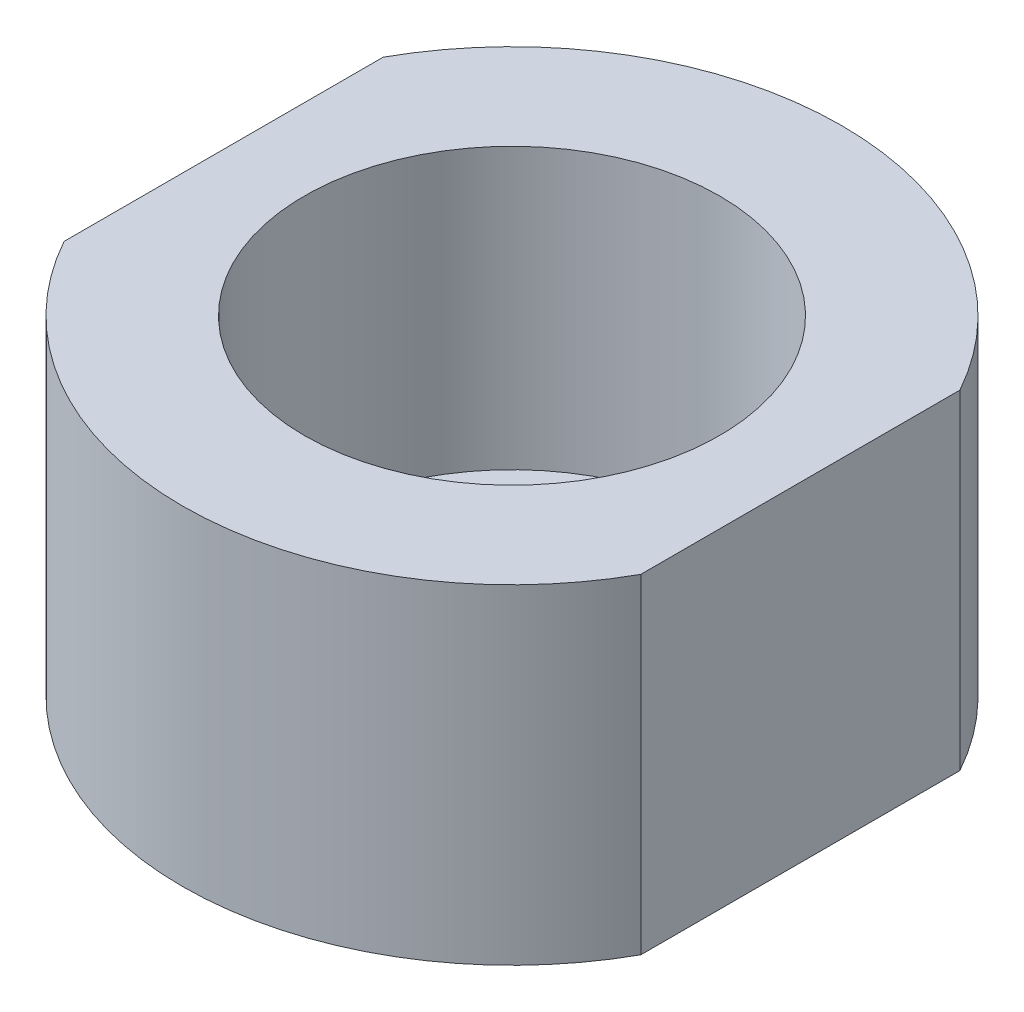
ISO-10303-21;
HEADER;
FILE_DESCRIPTION(('STEP AP214'),'2;1');
FILE_NAME('part.step','',(''),(''),'','','');
FILE_SCHEMA(('AUTOMOTIVE_DESIGN { 1 0 10303 214 1 1 1 1 }'));
ENDSEC;
DATA;
#1=APPLICATION_CONTEXT('core data for automotive mechanical design processes');
#2=APPLICATION_PROTOCOL_DEFINITION('international standard','automotive_design',2000,#1);
#3=PRODUCT_CONTEXT('',#1,'mechanical');
#4=PRODUCT('Part','Part','',(#3));
#5=PRODUCT_RELATED_PRODUCT_CATEGORY('part','',(#4));
#6=PRODUCT_DEFINITION_FORMATION('','',#4);
#7=PRODUCT_DEFINITION_CONTEXT('part definition',#1,'design');
#8=PRODUCT_DEFINITION('design','',#6,#7);
#9=PRODUCT_DEFINITION_SHAPE('','',#8);
#10=(LENGTH_UNIT() NAMED_UNIT(*) SI_UNIT(.MILLI.,.METRE.));
#11=(NAMED_UNIT(*) PLANE_ANGLE_UNIT() SI_UNIT($,.RADIAN.));
#12=(NAMED_UNIT(*) SI_UNIT($,.STERADIAN.) SOLID_ANGLE_UNIT());
#13=UNCERTAINTY_MEASURE_WITH_UNIT(LENGTH_MEASURE(1.E-05),#10,'distance_accuracy_value','');
#14=(GEOMETRIC_REPRESENTATION_CONTEXT(3) GLOBAL_UNCERTAINTY_ASSIGNED_CONTEXT((#13)) GLOBAL_UNIT_ASSIGNED_CONTEXT((#10,
#11,#12)) REPRESENTATION_CONTEXT('',''));
#15=CARTESIAN_POINT('',(0.,0.,0.));
#16=DIRECTION('',(0.,0.,1.));
#17=DIRECTION('',(1.,0.,0.));
#18=AXIS2_PLACEMENT_3D('',#15,#16,#17);
#19=CARTESIAN_POINT('',(0.,25.4,0.));
#20=DIRECTION('',(0.,-1.,0.));
#21=DIRECTION('',(0.,0.,-1.));
#22=AXIS2_PLACEMENT_3D('',#19,#20,#21);
#23=CYLINDRICAL_SURFACE('',#22,25.4);
#24=DIRECTION('',(0.,-1.,0.));
#25=VECTOR('',#24,1.);
#26=CARTESIAN_POINT('',(22.225,25.4,-12.2967221242086));
#27=LINE('',#26,#25);
#28=CARTESIAN_POINT('',(22.225,0.,-12.2967221242086));
#29=VERTEX_POINT('',#28);
#30=CARTESIAN_POINT('',(22.225,25.4,-12.2967221242086));
#31=VERTEX_POINT('',#30);
#32=EDGE_CURVE('E72',#29,#31,#27,.F.);
#33=ORIENTED_EDGE('',*,*,#32,.F.);
#34=CARTESIAN_POINT('',(0.,0.,0.));
#35=DIRECTION('',(0.,1.,0.));
#36=DIRECTION('',(0.,0.,1.));
#37=AXIS2_PLACEMENT_3D('',#34,#35,#36);
#38=CIRCLE('',#37,25.4);
#39=CARTESIAN_POINT('',(-22.225,0.,-12.2967221242086));
#40=VERTEX_POINT('',#39);
#41=EDGE_CURVE('E92',#29,#40,#38,.T.);
#42=ORIENTED_EDGE('',*,*,#41,.T.);
#43=DIRECTION('',(0.,-1.,0.));
#44=VECTOR('',#43,1.);
#45=CARTESIAN_POINT('',(-22.225,25.4,-12.2967221242086));
#46=LINE('',#45,#44);
#47=CARTESIAN_POINT('',(-22.225,25.4,-12.2967221242086));
#48=VERTEX_POINT('',#47);
#49=EDGE_CURVE('E127',#48,#40,#46,.T.);
#50=ORIENTED_EDGE('',*,*,#49,.F.);
#51=CARTESIAN_POINT('',(0.,25.4,0.));
#52=DIRECTION('',(0.,1.,0.));
#53=DIRECTION('',(0.,0.,1.));
#54=AXIS2_PLACEMENT_3D('',#51,#52,#53);
#55=CIRCLE('',#54,25.4);
#56=EDGE_CURVE('E13',#31,#48,#55,.T.);
#57=ORIENTED_EDGE('',*,*,#56,.F.);
#58=EDGE_LOOP('',(#33,#42,#50,#57));
#59=FACE_BOUND('',#58,.T.);
#60=ADVANCED_FACE('F47',(#59),#23,.T.);
#61=CARTESIAN_POINT('',(-22.225,0.,12.2967221242086));
#62=VERTEX_POINT('',#61);
#63=CARTESIAN_POINT('',(22.225,0.,12.2967221242085));
#64=VERTEX_POINT('',#63);
#65=EDGE_CURVE('E51',#62,#64,#38,.T.);
#66=ORIENTED_EDGE('',*,*,#65,.T.);
#67=DIRECTION('',(0.,-1.,0.));
#68=VECTOR('',#67,1.);
#69=CARTESIAN_POINT('',(22.225,25.4,12.2967221242086));
#70=LINE('',#69,#68);
#71=CARTESIAN_POINT('',(22.225,25.4,12.2967221242086));
#72=VERTEX_POINT('',#71);
#73=EDGE_CURVE('E93',#64,#72,#70,.F.);
#74=ORIENTED_EDGE('',*,*,#73,.T.);
#75=CARTESIAN_POINT('',(-22.225,25.4,12.2967221242086));
#76=VERTEX_POINT('',#75);
#77=EDGE_CURVE('E56',#76,#72,#55,.T.);
#78=ORIENTED_EDGE('',*,*,#77,.F.);
#79=DIRECTION('',(0.,-1.,0.));
#80=VECTOR('',#79,1.);
#81=CARTESIAN_POINT('',(-22.225,25.4,12.2967221242086));
#82=LINE('',#81,#80);
#83=EDGE_CURVE('E64',#76,#62,#82,.T.);
#84=ORIENTED_EDGE('',*,*,#83,.T.);
#85=EDGE_LOOP('',(#66,#74,#78,#84));
#86=FACE_BOUND('',#85,.T.);
#87=ADVANCED_FACE('F49',(#86),#23,.T.);
#88=CARTESIAN_POINT('',(0.,25.4,0.));
#89=DIRECTION('',(0.,1.,0.));
#90=DIRECTION('',(0.,0.,1.));
#91=AXIS2_PLACEMENT_3D('',#88,#89,#90);
#92=PLANE('',#91);
#93=CARTESIAN_POINT('',(0.,25.4,0.));
#94=DIRECTION('',(0.,1.,0.));
#95=DIRECTION('',(0.,0.,1.));
#96=AXIS2_PLACEMENT_3D('',#93,#94,#95);
#97=CIRCLE('',#96,16.);
#98=CARTESIAN_POINT('',(0.,25.4,16.));
#99=VERTEX_POINT('',#98);
#100=EDGE_CURVE('E114',#99,#99,#97,.T.);
#101=ORIENTED_EDGE('',*,*,#100,.F.);
#102=EDGE_LOOP('',(#101));
#103=FACE_BOUND('',#102,.T.);
#104=ORIENTED_EDGE('',*,*,#77,.T.);
#105=DIRECTION('',(0.,0.,-1.));
#106=VECTOR('',#105,1.);
#107=CARTESIAN_POINT('',(22.225,25.4,25.401));
#108=LINE('',#107,#106);
#109=EDGE_CURVE('E120',#72,#31,#108,.T.);
#110=ORIENTED_EDGE('',*,*,#109,.T.);
#111=ORIENTED_EDGE('',*,*,#56,.T.);
#112=DIRECTION('',(0.,0.,-1.));
#113=VECTOR('',#112,1.);
#114=CARTESIAN_POINT('',(-22.225,25.4,25.401));
#115=LINE('',#114,#113);
#116=EDGE_CURVE('E94',#76,#48,#115,.T.);
#117=ORIENTED_EDGE('',*,*,#116,.F.);
#118=EDGE_LOOP('',(#104,#110,#111,#117));
#119=FACE_BOUND('',#118,.T.);
#120=ADVANCED_FACE('F150',(#103,#119),#92,.T.);
#121=CARTESIAN_POINT('',(0.,0.,0.));
#122=DIRECTION('',(0.,1.,0.));
#123=DIRECTION('',(0.,0.,1.));
#124=AXIS2_PLACEMENT_3D('',#121,#122,#123);
#125=PLANE('',#124);
#126=CARTESIAN_POINT('',(0.,0.,-8.89));
#127=DIRECTION('',(0.,1.,0.));
#128=DIRECTION('',(0.,0.,1.));
#129=AXIS2_PLACEMENT_3D('',#126,#127,#128);
#130=CIRCLE('',#129,1.);
#131=CARTESIAN_POINT('',(0.,0.,-7.89));
#132=VERTEX_POINT('',#131);
#133=EDGE_CURVE('E129',#132,#132,#130,.F.);
#134=ORIENTED_EDGE('',*,*,#133,.F.);
#135=EDGE_LOOP('',(#134));
#136=FACE_BOUND('',#135,.T.);
#137=CARTESIAN_POINT('',(7.6989658396442,0.,4.44499999999969));
#138=DIRECTION('',(0.,1.,0.));
#139=DIRECTION('',(0.,0.,1.));
#140=AXIS2_PLACEMENT_3D('',#137,#138,#139);
#141=CIRCLE('',#140,1.);
#142=CARTESIAN_POINT('',(7.6989658396442,0.,5.44499999999969));
#143=VERTEX_POINT('',#142);
#144=EDGE_CURVE('E138',#143,#143,#141,.F.);
#145=ORIENTED_EDGE('',*,*,#144,.F.);
#146=EDGE_LOOP('',(#145));
#147=FACE_BOUND('',#146,.T.);
#148=CARTESIAN_POINT('',(-7.69896583964312,0.,4.44500000000031));
#149=DIRECTION('',(0.,1.,0.));
#150=DIRECTION('',(0.,0.,1.));
#151=AXIS2_PLACEMENT_3D('',#148,#149,#150);
#152=CIRCLE('',#151,1.);
#153=CARTESIAN_POINT('',(-7.69896583964312,0.,5.44500000000031));
#154=VERTEX_POINT('',#153);
#155=EDGE_CURVE('E132',#154,#154,#152,.F.);
#156=ORIENTED_EDGE('',*,*,#155,.F.);
#157=EDGE_LOOP('',(#156));
#158=FACE_BOUND('',#157,.T.);
#159=ORIENTED_EDGE('',*,*,#41,.F.);
#160=DIRECTION('',(0.,0.,-1.));
#161=VECTOR('',#160,1.);
#162=CARTESIAN_POINT('',(22.225,0.,-12.2967221242086));
#163=LINE('',#162,#161);
#164=EDGE_CURVE('E97',#64,#29,#163,.T.);
#165=ORIENTED_EDGE('',*,*,#164,.F.);
#166=ORIENTED_EDGE('',*,*,#65,.F.);
#167=DIRECTION('',(0.,0.,1.));
#168=VECTOR('',#167,1.);
#169=CARTESIAN_POINT('',(-22.225,0.,12.2967221242086));
#170=LINE('',#169,#168);
#171=EDGE_CURVE('E104',#40,#62,#170,.T.);
#172=ORIENTED_EDGE('',*,*,#171,.F.);
#173=EDGE_LOOP('',(#159,#165,#166,#172));
#174=FACE_BOUND('',#173,.T.);
#175=ADVANCED_FACE('F107',(#136,#147,#158,#174),#125,.F.);
#176=CARTESIAN_POINT('',(0.,-45.254833995939,0.));
#177=DIRECTION('',(0.,1.,0.));
#178=DIRECTION('',(0.,0.,1.));
#179=AXIS2_PLACEMENT_3D('',#176,#177,#178);
#180=CYLINDRICAL_SURFACE('',#179,16.);
#181=CARTESIAN_POINT('',(0.,3.81,0.));
#182=DIRECTION('',(0.,1.,0.));
#183=DIRECTION('',(0.,0.,1.));
#184=AXIS2_PLACEMENT_3D('',#181,#182,#183);
#185=CIRCLE('',#184,16.);
#186=CARTESIAN_POINT('',(0.,3.80999999999999,16.));
#187=VERTEX_POINT('',#186);
#188=EDGE_CURVE('E110',#187,#187,#185,.F.);
#189=CARTESIAN_POINT('',(0.,3.80999999999999,16.));
#190=CARTESIAN_POINT('',(0.,4.03489583333333,16.));
#191=CARTESIAN_POINT('',(0.,4.25979166666666,16.));
#192=CARTESIAN_POINT('',(0.,4.70958333333333,16.));
#193=CARTESIAN_POINT('',(0.,4.93447916666666,16.));
#194=CARTESIAN_POINT('',(0.,5.38427083333333,16.));
#195=CARTESIAN_POINT('',(0.,5.60916666666666,16.));
#196=CARTESIAN_POINT('',(0.,6.05895833333333,16.));
#197=CARTESIAN_POINT('',(0.,6.28385416666666,16.));
#198=CARTESIAN_POINT('',(0.,6.73364583333333,16.));
#199=CARTESIAN_POINT('',(0.,6.95854166666666,16.));
#200=CARTESIAN_POINT('',(0.,7.40833333333333,16.));
#201=CARTESIAN_POINT('',(0.,7.63322916666666,16.));
#202=CARTESIAN_POINT('',(0.,8.08302083333333,16.));
#203=CARTESIAN_POINT('',(0.,8.30791666666667,16.));
#204=CARTESIAN_POINT('',(0.,8.75770833333333,16.));
#205=CARTESIAN_POINT('',(0.,8.98260416666666,16.));
#206=CARTESIAN_POINT('',(0.,9.43239583333333,16.));
#207=CARTESIAN_POINT('',(0.,9.65729166666666,16.));
#208=CARTESIAN_POINT('',(0.,10.1070833333333,16.));
#209=CARTESIAN_POINT('',(0.,10.3319791666667,16.));
#210=CARTESIAN_POINT('',(0.,10.7817708333333,16.));
#211=CARTESIAN_POINT('',(0.,11.0066666666667,16.));
#212=CARTESIAN_POINT('',(0.,11.4564583333333,16.));
#213=CARTESIAN_POINT('',(0.,11.6813541666667,16.));
#214=CARTESIAN_POINT('',(0.,12.1311458333333,16.));
#215=CARTESIAN_POINT('',(0.,12.3560416666667,16.));
#216=CARTESIAN_POINT('',(0.,12.8058333333333,16.));
#217=CARTESIAN_POINT('',(0.,13.0307291666667,16.));
#218=CARTESIAN_POINT('',(0.,13.4805208333333,16.));
#219=CARTESIAN_POINT('',(0.,13.7054166666667,16.));
#220=CARTESIAN_POINT('',(0.,14.1552083333333,16.));
#221=CARTESIAN_POINT('',(0.,14.3801041666667,16.));
#222=CARTESIAN_POINT('',(0.,14.8298958333333,16.));
#223=CARTESIAN_POINT('',(0.,15.0547916666667,16.));
#224=CARTESIAN_POINT('',(0.,15.5045833333333,16.));
#225=CARTESIAN_POINT('',(0.,15.7294791666667,16.));
#226=CARTESIAN_POINT('',(0.,16.1792708333333,16.));
#227=CARTESIAN_POINT('',(0.,16.4041666666667,16.));
#228=CARTESIAN_POINT('',(0.,16.8539583333333,16.));
#229=CARTESIAN_POINT('',(0.,17.0788541666667,16.));
#230=CARTESIAN_POINT('',(0.,17.5286458333333,16.));
#231=CARTESIAN_POINT('',(0.,17.7535416666667,16.));
#232=CARTESIAN_POINT('',(0.,18.2033333333333,16.));
#233=CARTESIAN_POINT('',(0.,18.4282291666667,16.));
#234=CARTESIAN_POINT('',(0.,18.8780208333333,16.));
#235=CARTESIAN_POINT('',(0.,19.1029166666667,16.));
#236=CARTESIAN_POINT('',(0.,19.5527083333333,16.));
#237=CARTESIAN_POINT('',(0.,19.7776041666667,16.));
#238=CARTESIAN_POINT('',(0.,20.2273958333333,16.));
#239=CARTESIAN_POINT('',(0.,20.4522916666667,16.));
#240=CARTESIAN_POINT('',(0.,20.9020833333333,16.));
#241=CARTESIAN_POINT('',(0.,21.1269791666667,16.));
#242=CARTESIAN_POINT('',(0.,21.5767708333333,16.));
#243=CARTESIAN_POINT('',(0.,21.8016666666667,16.));
#244=CARTESIAN_POINT('',(0.,22.2514583333333,16.));
#245=CARTESIAN_POINT('',(0.,22.4763541666667,16.));
#246=CARTESIAN_POINT('',(0.,22.9261458333333,16.));
#247=CARTESIAN_POINT('',(0.,23.1510416666667,16.));
#248=CARTESIAN_POINT('',(0.,23.6008333333333,16.));
#249=CARTESIAN_POINT('',(0.,23.8257291666667,16.));
#250=CARTESIAN_POINT('',(0.,24.2755208333333,16.));
#251=CARTESIAN_POINT('',(0.,24.5004166666667,16.));
#252=CARTESIAN_POINT('',(0.,24.9502083333333,16.));
#253=CARTESIAN_POINT('',(0.,25.1751041666667,16.));
#254=CARTESIAN_POINT('',(0.,25.4,16.));
#255=B_SPLINE_CURVE_WITH_KNOTS('',3,(#189,#190,#191,#192,#193,#194,#195,#196,#197,#198,#199,
#200,#201,#202,#203,#204,#205,#206,#207,#208,#209,#210,#211,#212,#213,#214,#215,#216,#217,#218,
#219,#220,#221,#222,#223,#224,#225,#226,#227,#228,#229,#230,#231,#232,#233,#234,#235,#236,#237,
#238,#239,#240,#241,#242,#243,#244,#245,#246,#247,#248,#249,#250,#251,#252,#253,#254),
.UNSPECIFIED.,.F.,.F.,(4,2,2,2,2,2,2,2,2,2,2,2,2,2,2,2,2,2,2,2,2,2,2,2,2,2,2,2,2,2,2,2,4),(0.,
0.6746875,1.349375,2.0240625,2.69875,3.3734375,4.048125,4.72281250000001,5.3975,
6.07218750000001,6.74687500000001,7.42156250000001,8.09625000000001,8.77093750000001,
9.44562500000001,10.1203125,10.795,11.4696875,12.144375,12.8190625,13.49375,14.1684375,
14.843125,15.5178125,16.1925,16.8671875,17.541875,18.2165625,18.89125,19.5659375,20.240625,
20.9153125,21.59),.UNSPECIFIED.);
#256=EDGE_CURVE('BSEAM175',#187,#99,#255,.T.);
#257=ORIENTED_EDGE('',*,*,#188,.T.);
#258=ORIENTED_EDGE('',*,*,#100,.T.);
#259=ORIENTED_EDGE('',*,*,#256,.T.);
#260=ORIENTED_EDGE('',*,*,#256,.F.);
#261=EDGE_LOOP('',(#257,#259,#258,#260));
#262=FACE_BOUND('',#261,.T.);
#263=ADVANCED_FACE('F175',(#262),#180,.F.);
#264=CARTESIAN_POINT('',(0.,3.81,0.));
#265=DIRECTION('',(0.,1.,0.));
#266=DIRECTION('',(0.,0.,1.));
#267=AXIS2_PLACEMENT_3D('',#264,#265,#266);
#268=PLANE('',#267);
#269=CARTESIAN_POINT('',(0.,3.81,-8.89));
#270=DIRECTION('',(0.,1.,0.));
#271=DIRECTION('',(0.,0.,1.));
#272=AXIS2_PLACEMENT_3D('',#269,#270,#271);
#273=CIRCLE('',#272,1.);
#274=CARTESIAN_POINT('',(0.,3.81,-7.89));
#275=VERTEX_POINT('',#274);
#276=EDGE_CURVE('E141',#275,#275,#273,.T.);
#277=ORIENTED_EDGE('',*,*,#276,.F.);
#278=EDGE_LOOP('',(#277));
#279=FACE_BOUND('',#278,.T.);
#280=CARTESIAN_POINT('',(7.6989658396442,3.81,4.44499999999969));
#281=DIRECTION('',(0.,1.,0.));
#282=DIRECTION('',(0.,0.,1.));
#283=AXIS2_PLACEMENT_3D('',#280,#281,#282);
#284=CIRCLE('',#283,1.);
#285=CARTESIAN_POINT('',(7.6989658396442,3.81,5.44499999999969));
#286=VERTEX_POINT('',#285);
#287=EDGE_CURVE('E135',#286,#286,#284,.T.);
#288=ORIENTED_EDGE('',*,*,#287,.F.);
#289=EDGE_LOOP('',(#288));
#290=FACE_BOUND('',#289,.T.);
#291=CARTESIAN_POINT('',(-7.69896583964312,3.81,4.44500000000031));
#292=DIRECTION('',(0.,1.,0.));
#293=DIRECTION('',(0.,0.,1.));
#294=AXIS2_PLACEMENT_3D('',#291,#292,#293);
#295=CIRCLE('',#294,1.);
#296=CARTESIAN_POINT('',(-7.69896583964312,3.81,5.44500000000031));
#297=VERTEX_POINT('',#296);
#298=EDGE_CURVE('E103',#297,#297,#295,.T.);
#299=ORIENTED_EDGE('',*,*,#298,.F.);
#300=EDGE_LOOP('',(#299));
#301=FACE_BOUND('',#300,.T.);
#302=ORIENTED_EDGE('',*,*,#188,.F.);
#303=EDGE_LOOP('',(#302));
#304=FACE_BOUND('',#303,.T.);
#305=ADVANCED_FACE('F191',(#279,#290,#301,#304),#268,.T.);
#306=CARTESIAN_POINT('',(-22.225,25.4,25.401));
#307=DIRECTION('',(-1.,0.,0.));
#308=DIRECTION('',(0.,-1.,0.));
#309=AXIS2_PLACEMENT_3D('',#306,#307,#308);
#310=PLANE('',#309);
#311=ORIENTED_EDGE('',*,*,#116,.T.);
#312=ORIENTED_EDGE('',*,*,#49,.T.);
#313=ORIENTED_EDGE('',*,*,#171,.T.);
#314=ORIENTED_EDGE('',*,*,#83,.F.);
#315=EDGE_LOOP('',(#311,#312,#313,#314));
#316=FACE_BOUND('',#315,.T.);
#317=ADVANCED_FACE('F148',(#316),#310,.T.);
#318=CARTESIAN_POINT('',(22.225,25.4,25.401));
#319=DIRECTION('',(1.,0.,0.));
#320=DIRECTION('',(0.,1.,0.));
#321=AXIS2_PLACEMENT_3D('',#318,#319,#320);
#322=PLANE('',#321);
#323=ORIENTED_EDGE('',*,*,#73,.F.);
#324=ORIENTED_EDGE('',*,*,#164,.T.);
#325=ORIENTED_EDGE('',*,*,#32,.T.);
#326=ORIENTED_EDGE('',*,*,#109,.F.);
#327=EDGE_LOOP('',(#323,#324,#325,#326));
#328=FACE_BOUND('',#327,.T.);
#329=ADVANCED_FACE('F98',(#328),#322,.T.);
#330=CARTESIAN_POINT('',(-7.69896583964312,-0.00100000000000013,4.44500000000031));
#331=DIRECTION('',(0.,1.,0.));
#332=DIRECTION('',(0.,0.,1.));
#333=AXIS2_PLACEMENT_3D('',#330,#331,#332);
#334=CYLINDRICAL_SURFACE('',#333,1.);
#335=ORIENTED_EDGE('',*,*,#298,.T.);
#336=EDGE_LOOP('',(#335));
#337=FACE_BOUND('',#336,.T.);
#338=ORIENTED_EDGE('',*,*,#155,.T.);
#339=EDGE_LOOP('',(#338));
#340=FACE_BOUND('',#339,.T.);
#341=ADVANCED_FACE('F204',(#337,#340),#334,.F.);
#342=CARTESIAN_POINT('',(7.6989658396442,-0.00100000000000013,4.44499999999969));
#343=DIRECTION('',(0.,1.,0.));
#344=DIRECTION('',(0.,0.,1.));
#345=AXIS2_PLACEMENT_3D('',#342,#343,#344);
#346=CYLINDRICAL_SURFACE('',#345,1.);
#347=ORIENTED_EDGE('',*,*,#287,.T.);
#348=EDGE_LOOP('',(#347));
#349=FACE_BOUND('',#348,.T.);
#350=ORIENTED_EDGE('',*,*,#144,.T.);
#351=EDGE_LOOP('',(#350));
#352=FACE_BOUND('',#351,.T.);
#353=ADVANCED_FACE('F211',(#349,#352),#346,.F.);
#354=CARTESIAN_POINT('',(0.,-0.00100000000000013,-8.89));
#355=DIRECTION('',(0.,1.,0.));
#356=DIRECTION('',(0.,0.,1.));
#357=AXIS2_PLACEMENT_3D('',#354,#355,#356);
#358=CYLINDRICAL_SURFACE('',#357,1.);
#359=ORIENTED_EDGE('',*,*,#276,.T.);
#360=EDGE_LOOP('',(#359));
#361=FACE_BOUND('',#360,.T.);
#362=ORIENTED_EDGE('',*,*,#133,.T.);
#363=EDGE_LOOP('',(#362));
#364=FACE_BOUND('',#363,.T.);
#365=ADVANCED_FACE('F219',(#361,#364),#358,.F.);
#366=CLOSED_SHELL('',(#60,#87,#120,#175,#263,#305,#317,#329,#341,#353,#365));
#367=MANIFOLD_SOLID_BREP('B2',#366);
#368=ADVANCED_BREP_SHAPE_REPRESENTATION('',(#18,#367),#14);
#369=SHAPE_DEFINITION_REPRESENTATION(#9,#368);
ENDSEC;
END-ISO-10303-21;
